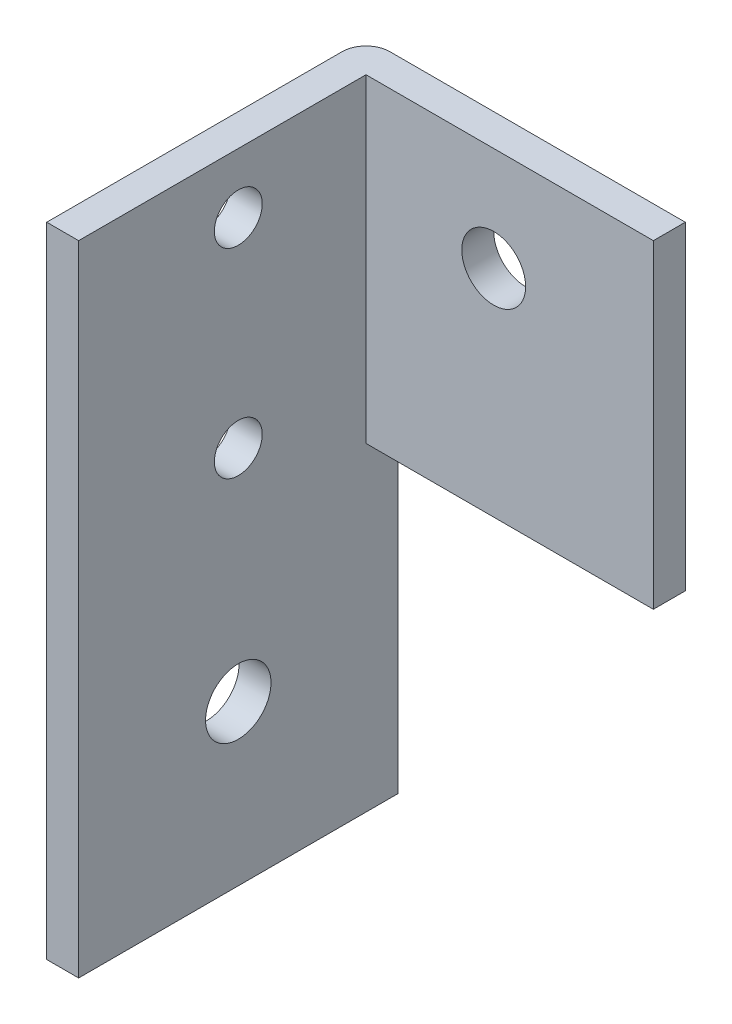
ISO-10303-21;
HEADER;
FILE_DESCRIPTION(('STEP AP214'),'2;1');
FILE_NAME('part.step','',(''),(''),'','','');
FILE_SCHEMA(('AUTOMOTIVE_DESIGN { 1 0 10303 214 1 1 1 1 }'));
ENDSEC;
DATA;
#1=APPLICATION_CONTEXT('core data for automotive mechanical design processes');
#2=APPLICATION_PROTOCOL_DEFINITION('international standard','automotive_design',2000,#1);
#3=PRODUCT_CONTEXT('',#1,'mechanical');
#4=PRODUCT('Part','Part','',(#3));
#5=PRODUCT_RELATED_PRODUCT_CATEGORY('part','',(#4));
#6=PRODUCT_DEFINITION_FORMATION('','',#4);
#7=PRODUCT_DEFINITION_CONTEXT('part definition',#1,'design');
#8=PRODUCT_DEFINITION('design','',#6,#7);
#9=PRODUCT_DEFINITION_SHAPE('','',#8);
#10=(LENGTH_UNIT() NAMED_UNIT(*) SI_UNIT(.MILLI.,.METRE.));
#11=(NAMED_UNIT(*) PLANE_ANGLE_UNIT() SI_UNIT($,.RADIAN.));
#12=(NAMED_UNIT(*) SI_UNIT($,.STERADIAN.) SOLID_ANGLE_UNIT());
#13=UNCERTAINTY_MEASURE_WITH_UNIT(LENGTH_MEASURE(1.E-05),#10,'distance_accuracy_value','');
#14=(GEOMETRIC_REPRESENTATION_CONTEXT(3) GLOBAL_UNCERTAINTY_ASSIGNED_CONTEXT((#13)) GLOBAL_UNIT_ASSIGNED_CONTEXT((#10,
#11,#12)) REPRESENTATION_CONTEXT('',''));
#15=CARTESIAN_POINT('',(0.,0.,0.));
#16=DIRECTION('',(0.,0.,1.));
#17=DIRECTION('',(1.,0.,0.));
#18=AXIS2_PLACEMENT_3D('',#15,#16,#17);
#19=CARTESIAN_POINT('',(-19.6589595375722,80.,-19.121387283237));
#20=DIRECTION('',(0.,0.,-1.));
#21=DIRECTION('',(-1.,0.,0.));
#22=AXIS2_PLACEMENT_3D('',#19,#20,#21);
#23=PLANE('',#22);
#24=CARTESIAN_POINT('',(-2.65895953757226,67.,-19.121387283237));
#25=DIRECTION('',(0.,0.,-1.));
#26=DIRECTION('',(-1.,0.,0.));
#27=AXIS2_PLACEMENT_3D('',#24,#25,#26);
#28=CIRCLE('',#27,3.99999999999999);
#29=CARTESIAN_POINT('',(-6.65895953757225,67.,-19.121387283237));
#30=VERTEX_POINT('',#29);
#31=EDGE_CURVE('E186',#30,#30,#28,.T.);
#32=ORIENTED_EDGE('',*,*,#31,.T.);
#33=EDGE_LOOP('',(#32));
#34=FACE_BOUND('',#33,.T.);
#35=DIRECTION('',(0.,-1.,0.));
#36=VECTOR('',#35,1.);
#37=CARTESIAN_POINT('',(-18.6589595375723,80.,-19.121387283237));
#38=LINE('',#37,#36);
#39=CARTESIAN_POINT('',(-18.6589595375723,80.,-19.121387283237));
#40=VERTEX_POINT('',#39);
#41=CARTESIAN_POINT('',(-18.6589595375723,40.,-19.121387283237));
#42=VERTEX_POINT('',#41);
#43=EDGE_CURVE('E117',#40,#42,#38,.T.);
#44=ORIENTED_EDGE('',*,*,#43,.T.);
#45=DIRECTION('',(1.,0.,0.));
#46=VECTOR('',#45,1.);
#47=CARTESIAN_POINT('',(-19.6589595375722,40.,-19.121387283237));
#48=LINE('',#47,#46);
#49=CARTESIAN_POINT('',(17.3410404624277,40.,-19.121387283237));
#50=VERTEX_POINT('',#49);
#51=EDGE_CURVE('E199',#42,#50,#48,.T.);
#52=ORIENTED_EDGE('',*,*,#51,.T.);
#53=DIRECTION('',(0.,-1.,0.));
#54=VECTOR('',#53,1.);
#55=CARTESIAN_POINT('',(17.3410404624277,80.,-19.121387283237));
#56=LINE('',#55,#54);
#57=CARTESIAN_POINT('',(17.3410404624277,80.,-19.121387283237));
#58=VERTEX_POINT('',#57);
#59=EDGE_CURVE('E11',#58,#50,#56,.T.);
#60=ORIENTED_EDGE('',*,*,#59,.F.);
#61=DIRECTION('',(1.,0.,0.));
#62=VECTOR('',#61,1.);
#63=CARTESIAN_POINT('',(-19.6589595375722,80.,-19.121387283237));
#64=LINE('',#63,#62);
#65=EDGE_CURVE('E86',#40,#58,#64,.T.);
#66=ORIENTED_EDGE('',*,*,#65,.F.);
#67=EDGE_LOOP('',(#44,#52,#60,#66));
#68=FACE_BOUND('',#67,.T.);
#69=ADVANCED_FACE('F37',(#34,#68),#23,.F.);
#70=CARTESIAN_POINT('',(17.3410404624277,80.,-23.121387283237));
#71=DIRECTION('',(1.,0.,0.));
#72=DIRECTION('',(0.,0.,-1.));
#73=AXIS2_PLACEMENT_3D('',#70,#71,#72);
#74=PLANE('',#73);
#75=DIRECTION('',(0.,0.,1.));
#76=VECTOR('',#75,1.);
#77=CARTESIAN_POINT('',(17.3410404624277,40.,-23.121387283237));
#78=LINE('',#77,#76);
#79=CARTESIAN_POINT('',(17.3410404624277,40.,-23.121387283237));
#80=VERTEX_POINT('',#79);
#81=EDGE_CURVE('E197',#80,#50,#78,.T.);
#82=ORIENTED_EDGE('',*,*,#81,.F.);
#83=DIRECTION('',(0.,-1.,0.));
#84=VECTOR('',#83,1.);
#85=CARTESIAN_POINT('',(17.3410404624277,80.,-23.121387283237));
#86=LINE('',#85,#84);
#87=CARTESIAN_POINT('',(17.3410404624277,80.,-23.121387283237));
#88=VERTEX_POINT('',#87);
#89=EDGE_CURVE('E46',#88,#80,#86,.T.);
#90=ORIENTED_EDGE('',*,*,#89,.F.);
#91=DIRECTION('',(0.,0.,1.));
#92=VECTOR('',#91,1.);
#93=CARTESIAN_POINT('',(17.3410404624277,80.,-23.121387283237));
#94=LINE('',#93,#92);
#95=EDGE_CURVE('E160',#88,#58,#94,.T.);
#96=ORIENTED_EDGE('',*,*,#95,.T.);
#97=ORIENTED_EDGE('',*,*,#59,.T.);
#98=EDGE_LOOP('',(#82,#90,#96,#97));
#99=FACE_BOUND('',#98,.T.);
#100=ADVANCED_FACE('F232',(#99),#74,.T.);
#101=CARTESIAN_POINT('',(-19.6589595375722,80.,-23.121387283237));
#102=DIRECTION('',(0.,0.,-1.));
#103=DIRECTION('',(-1.,0.,0.));
#104=AXIS2_PLACEMENT_3D('',#101,#102,#103);
#105=PLANE('',#104);
#106=CARTESIAN_POINT('',(-2.65895953757226,67.,-23.121387283237));
#107=DIRECTION('',(0.,0.,-1.));
#108=DIRECTION('',(-1.,0.,0.));
#109=AXIS2_PLACEMENT_3D('',#106,#107,#108);
#110=CIRCLE('',#109,3.99999999999999);
#111=CARTESIAN_POINT('',(-6.65895953757225,67.,-23.121387283237));
#112=VERTEX_POINT('',#111);
#113=EDGE_CURVE('E191',#112,#112,#110,.T.);
#114=ORIENTED_EDGE('',*,*,#113,.F.);
#115=EDGE_LOOP('',(#114));
#116=FACE_BOUND('',#115,.T.);
#117=DIRECTION('',(0.,1.,0.));
#118=VECTOR('',#117,1.);
#119=CARTESIAN_POINT('',(-18.6589595375723,40.,-23.121387283237));
#120=LINE('',#119,#118);
#121=CARTESIAN_POINT('',(-18.6589595375723,0.,-23.121387283237));
#122=VERTEX_POINT('',#121);
#123=CARTESIAN_POINT('',(-18.6589595375723,40.,-23.121387283237));
#124=VERTEX_POINT('',#123);
#125=EDGE_CURVE('E178',#122,#124,#120,.T.);
#126=ORIENTED_EDGE('',*,*,#125,.F.);
#127=DIRECTION('',(1.,0.,0.));
#128=VECTOR('',#127,1.);
#129=CARTESIAN_POINT('',(-19.6589595375722,0.,-23.121387283237));
#130=LINE('',#129,#128);
#131=CARTESIAN_POINT('',(-19.6589595375722,0.,-23.121387283237));
#132=VERTEX_POINT('',#131);
#133=EDGE_CURVE('E121',#132,#122,#130,.T.);
#134=ORIENTED_EDGE('',*,*,#133,.F.);
#135=DIRECTION('',(0.,-1.,0.));
#136=VECTOR('',#135,1.);
#137=CARTESIAN_POINT('',(-19.6589595375722,80.,-23.121387283237));
#138=LINE('',#137,#136);
#139=CARTESIAN_POINT('',(-19.6589595375722,80.,-23.121387283237));
#140=VERTEX_POINT('',#139);
#141=EDGE_CURVE('E137',#140,#132,#138,.T.);
#142=ORIENTED_EDGE('',*,*,#141,.F.);
#143=DIRECTION('',(1.,0.,0.));
#144=VECTOR('',#143,1.);
#145=CARTESIAN_POINT('',(-19.6589595375722,80.,-23.121387283237));
#146=LINE('',#145,#144);
#147=EDGE_CURVE('E163',#140,#88,#146,.T.);
#148=ORIENTED_EDGE('',*,*,#147,.T.);
#149=ORIENTED_EDGE('',*,*,#89,.T.);
#150=DIRECTION('',(1.,0.,0.));
#151=VECTOR('',#150,1.);
#152=CARTESIAN_POINT('',(38.7535883869143,40.,-23.121387283237));
#153=LINE('',#152,#151);
#154=EDGE_CURVE('E185',#124,#80,#153,.T.);
#155=ORIENTED_EDGE('',*,*,#154,.F.);
#156=EDGE_LOOP('',(#126,#134,#142,#148,#149,#155));
#157=FACE_BOUND('',#156,.T.);
#158=ADVANCED_FACE('F183',(#116,#157),#105,.T.);
#159=CARTESIAN_POINT('',(-19.6589595375723,80.,-20.121387283237));
#160=DIRECTION('',(0.,-1.,0.));
#161=DIRECTION('',(0.,0.,-1.));
#162=AXIS2_PLACEMENT_3D('',#159,#160,#161);
#163=CYLINDRICAL_SURFACE('',#162,3.);
#164=CARTESIAN_POINT('',(-19.6589595375723,0.,-20.121387283237));
#165=DIRECTION('',(0.,-1.,0.));
#166=DIRECTION('',(0.,0.,-1.));
#167=AXIS2_PLACEMENT_3D('',#164,#165,#166);
#168=CIRCLE('',#167,3.);
#169=CARTESIAN_POINT('',(-22.6589595375723,0.,-20.121387283237));
#170=VERTEX_POINT('',#169);
#171=EDGE_CURVE('E124',#170,#132,#168,.T.);
#172=ORIENTED_EDGE('',*,*,#171,.F.);
#173=DIRECTION('',(0.,-1.,0.));
#174=VECTOR('',#173,1.);
#175=CARTESIAN_POINT('',(-22.6589595375723,80.,-20.121387283237));
#176=LINE('',#175,#174);
#177=CARTESIAN_POINT('',(-22.6589595375723,80.,-20.121387283237));
#178=VERTEX_POINT('',#177);
#179=EDGE_CURVE('E106',#178,#170,#176,.T.);
#180=ORIENTED_EDGE('',*,*,#179,.F.);
#181=CARTESIAN_POINT('',(-19.6589595375723,80.,-20.121387283237));
#182=DIRECTION('',(0.,-1.,0.));
#183=DIRECTION('',(0.,0.,-1.));
#184=AXIS2_PLACEMENT_3D('',#181,#182,#183);
#185=CIRCLE('',#184,3.);
#186=EDGE_CURVE('E113',#178,#140,#185,.T.);
#187=ORIENTED_EDGE('',*,*,#186,.T.);
#188=ORIENTED_EDGE('',*,*,#141,.T.);
#189=EDGE_LOOP('',(#172,#180,#187,#188));
#190=FACE_BOUND('',#189,.T.);
#191=ADVANCED_FACE('F167',(#190),#163,.T.);
#192=CARTESIAN_POINT('',(-22.6589595375723,80.,16.878612716763));
#193=DIRECTION('',(-1.,0.,0.));
#194=DIRECTION('',(0.,0.,1.));
#195=AXIS2_PLACEMENT_3D('',#192,#193,#194);
#196=PLANE('',#195);
#197=CARTESIAN_POINT('',(-22.6589595375723,72.5,-3.12138728323695));
#198=DIRECTION('',(-1.,0.,0.));
#199=DIRECTION('',(0.,0.,1.));
#200=AXIS2_PLACEMENT_3D('',#197,#198,#199);
#201=CIRCLE('',#200,3.);
#202=CARTESIAN_POINT('',(-22.6589595375723,72.5,-0.12138728323695));
#203=VERTEX_POINT('',#202);
#204=EDGE_CURVE('E155',#203,#203,#201,.T.);
#205=ORIENTED_EDGE('',*,*,#204,.F.);
#206=EDGE_LOOP('',(#205));
#207=FACE_BOUND('',#206,.T.);
#208=CARTESIAN_POINT('',(-22.6589595375723,47.5,-3.12138728323695));
#209=DIRECTION('',(-1.,0.,0.));
#210=DIRECTION('',(0.,0.,1.));
#211=AXIS2_PLACEMENT_3D('',#208,#209,#210);
#212=CIRCLE('',#211,3.);
#213=CARTESIAN_POINT('',(-22.6589595375723,47.5,-0.121387283236947));
#214=VERTEX_POINT('',#213);
#215=EDGE_CURVE('E145',#214,#214,#212,.T.);
#216=ORIENTED_EDGE('',*,*,#215,.F.);
#217=EDGE_LOOP('',(#216));
#218=FACE_BOUND('',#217,.T.);
#219=CARTESIAN_POINT('',(-22.6589595375723,20.,-3.121387283237));
#220=DIRECTION('',(-1.,0.,0.));
#221=DIRECTION('',(0.,0.,1.));
#222=AXIS2_PLACEMENT_3D('',#219,#220,#221);
#223=CIRCLE('',#222,4.1);
#224=CARTESIAN_POINT('',(-22.6589595375723,20.,0.978612716763));
#225=VERTEX_POINT('',#224);
#226=EDGE_CURVE('E142',#225,#225,#223,.T.);
#227=ORIENTED_EDGE('',*,*,#226,.F.);
#228=EDGE_LOOP('',(#227));
#229=FACE_BOUND('',#228,.T.);
#230=DIRECTION('',(0.,0.,-1.));
#231=VECTOR('',#230,1.);
#232=CARTESIAN_POINT('',(-22.6589595375723,0.,16.878612716763));
#233=LINE('',#232,#231);
#234=CARTESIAN_POINT('',(-22.6589595375723,0.,16.878612716763));
#235=VERTEX_POINT('',#234);
#236=EDGE_CURVE('E104',#235,#170,#233,.T.);
#237=ORIENTED_EDGE('',*,*,#236,.F.);
#238=DIRECTION('',(0.,-1.,0.));
#239=VECTOR('',#238,1.);
#240=CARTESIAN_POINT('',(-22.6589595375723,80.,16.878612716763));
#241=LINE('',#240,#239);
#242=CARTESIAN_POINT('',(-22.6589595375723,80.,16.878612716763));
#243=VERTEX_POINT('',#242);
#244=EDGE_CURVE('E74',#243,#235,#241,.T.);
#245=ORIENTED_EDGE('',*,*,#244,.F.);
#246=DIRECTION('',(0.,0.,-1.));
#247=VECTOR('',#246,1.);
#248=CARTESIAN_POINT('',(-22.6589595375723,80.,16.878612716763));
#249=LINE('',#248,#247);
#250=EDGE_CURVE('E102',#243,#178,#249,.T.);
#251=ORIENTED_EDGE('',*,*,#250,.T.);
#252=ORIENTED_EDGE('',*,*,#179,.T.);
#253=EDGE_LOOP('',(#237,#245,#251,#252));
#254=FACE_BOUND('',#253,.T.);
#255=ADVANCED_FACE('F101',(#207,#218,#229,#254),#196,.T.);
#256=CARTESIAN_POINT('',(-18.6589595375723,80.,16.878612716763));
#257=DIRECTION('',(0.,0.,1.));
#258=DIRECTION('',(1.,0.,0.));
#259=AXIS2_PLACEMENT_3D('',#256,#257,#258);
#260=PLANE('',#259);
#261=DIRECTION('',(-1.,0.,0.));
#262=VECTOR('',#261,1.);
#263=CARTESIAN_POINT('',(-18.6589595375723,0.,16.878612716763));
#264=LINE('',#263,#262);
#265=CARTESIAN_POINT('',(-18.6589595375723,0.,16.878612716763));
#266=VERTEX_POINT('',#265);
#267=EDGE_CURVE('E129',#266,#235,#264,.T.);
#268=ORIENTED_EDGE('',*,*,#267,.F.);
#269=DIRECTION('',(0.,-1.,0.));
#270=VECTOR('',#269,1.);
#271=CARTESIAN_POINT('',(-18.6589595375723,80.,16.878612716763));
#272=LINE('',#271,#270);
#273=CARTESIAN_POINT('',(-18.6589595375723,80.,16.878612716763));
#274=VERTEX_POINT('',#273);
#275=EDGE_CURVE('E80',#274,#266,#272,.T.);
#276=ORIENTED_EDGE('',*,*,#275,.F.);
#277=DIRECTION('',(-1.,0.,0.));
#278=VECTOR('',#277,1.);
#279=CARTESIAN_POINT('',(-18.6589595375723,80.,16.878612716763));
#280=LINE('',#279,#278);
#281=EDGE_CURVE('E110',#274,#243,#280,.T.);
#282=ORIENTED_EDGE('',*,*,#281,.T.);
#283=ORIENTED_EDGE('',*,*,#244,.T.);
#284=EDGE_LOOP('',(#268,#276,#282,#283));
#285=FACE_BOUND('',#284,.T.);
#286=ADVANCED_FACE('F115',(#285),#260,.T.);
#287=CARTESIAN_POINT('',(-18.6589595375723,80.,16.878612716763));
#288=DIRECTION('',(-1.,0.,0.));
#289=DIRECTION('',(0.,0.,1.));
#290=AXIS2_PLACEMENT_3D('',#287,#288,#289);
#291=PLANE('',#290);
#292=DIRECTION('',(0.,0.,-1.));
#293=VECTOR('',#292,1.);
#294=CARTESIAN_POINT('',(-18.6589595375723,0.,16.878612716763));
#295=LINE('',#294,#293);
#296=EDGE_CURVE('E131',#266,#122,#295,.T.);
#297=ORIENTED_EDGE('',*,*,#296,.T.);
#298=ORIENTED_EDGE('',*,*,#125,.T.);
#299=DIRECTION('',(0.,0.,-1.));
#300=VECTOR('',#299,1.);
#301=CARTESIAN_POINT('',(-18.6589595375723,40.,-13.121387283237));
#302=LINE('',#301,#300);
#303=EDGE_CURVE('E188',#42,#124,#302,.T.);
#304=ORIENTED_EDGE('',*,*,#303,.F.);
#305=ORIENTED_EDGE('',*,*,#43,.F.);
#306=DIRECTION('',(0.,0.,-1.));
#307=VECTOR('',#306,1.);
#308=CARTESIAN_POINT('',(-18.6589595375723,80.,16.878612716763));
#309=LINE('',#308,#307);
#310=EDGE_CURVE('E55',#274,#40,#309,.T.);
#311=ORIENTED_EDGE('',*,*,#310,.F.);
#312=ORIENTED_EDGE('',*,*,#275,.T.);
#313=EDGE_LOOP('',(#297,#298,#304,#305,#311,#312));
#314=FACE_BOUND('',#313,.T.);
#315=CARTESIAN_POINT('',(-18.6589595375723,72.5,-3.12138728323695));
#316=DIRECTION('',(-1.,0.,0.));
#317=DIRECTION('',(0.,0.,1.));
#318=AXIS2_PLACEMENT_3D('',#315,#316,#317);
#319=CIRCLE('',#318,3.);
#320=CARTESIAN_POINT('',(-18.6589595375723,72.5,-0.12138728323695));
#321=VERTEX_POINT('',#320);
#322=EDGE_CURVE('E40',#321,#321,#319,.T.);
#323=ORIENTED_EDGE('',*,*,#322,.T.);
#324=EDGE_LOOP('',(#323));
#325=FACE_BOUND('',#324,.T.);
#326=CARTESIAN_POINT('',(-18.6589595375723,47.5,-3.12138728323695));
#327=DIRECTION('',(-1.,0.,0.));
#328=DIRECTION('',(0.,0.,1.));
#329=AXIS2_PLACEMENT_3D('',#326,#327,#328);
#330=CIRCLE('',#329,3.);
#331=CARTESIAN_POINT('',(-18.6589595375723,47.5,-0.121387283236947));
#332=VERTEX_POINT('',#331);
#333=EDGE_CURVE('E143',#332,#332,#330,.T.);
#334=ORIENTED_EDGE('',*,*,#333,.T.);
#335=EDGE_LOOP('',(#334));
#336=FACE_BOUND('',#335,.T.);
#337=CARTESIAN_POINT('',(-18.6589595375723,20.,-3.121387283237));
#338=DIRECTION('',(-1.,0.,0.));
#339=DIRECTION('',(0.,0.,1.));
#340=AXIS2_PLACEMENT_3D('',#337,#338,#339);
#341=CIRCLE('',#340,4.1);
#342=CARTESIAN_POINT('',(-18.6589595375723,20.,0.978612716763));
#343=VERTEX_POINT('',#342);
#344=EDGE_CURVE('E125',#343,#343,#341,.T.);
#345=ORIENTED_EDGE('',*,*,#344,.T.);
#346=EDGE_LOOP('',(#345));
#347=FACE_BOUND('',#346,.T.);
#348=ADVANCED_FACE('F174',(#314,#325,#336,#347),#291,.F.);
#349=CARTESIAN_POINT('',(-19.6589595375723,80.,-20.121387283237));
#350=DIRECTION('',(0.,-1.,0.));
#351=DIRECTION('',(-1.,0.,0.));
#352=AXIS2_PLACEMENT_3D('',#349,#350,#351);
#353=PLANE('',#352);
#354=ORIENTED_EDGE('',*,*,#65,.T.);
#355=ORIENTED_EDGE('',*,*,#95,.F.);
#356=ORIENTED_EDGE('',*,*,#147,.F.);
#357=ORIENTED_EDGE('',*,*,#186,.F.);
#358=ORIENTED_EDGE('',*,*,#250,.F.);
#359=ORIENTED_EDGE('',*,*,#281,.F.);
#360=ORIENTED_EDGE('',*,*,#310,.T.);
#361=EDGE_LOOP('',(#354,#355,#356,#357,#358,#359,#360));
#362=FACE_BOUND('',#361,.T.);
#363=ADVANCED_FACE('F109',(#362),#353,.F.);
#364=CARTESIAN_POINT('',(-19.6589595375723,0.,-20.121387283237));
#365=DIRECTION('',(0.,-1.,0.));
#366=DIRECTION('',(-1.,0.,0.));
#367=AXIS2_PLACEMENT_3D('',#364,#365,#366);
#368=PLANE('',#367);
#369=ORIENTED_EDGE('',*,*,#133,.T.);
#370=ORIENTED_EDGE('',*,*,#296,.F.);
#371=ORIENTED_EDGE('',*,*,#267,.T.);
#372=ORIENTED_EDGE('',*,*,#236,.T.);
#373=ORIENTED_EDGE('',*,*,#171,.T.);
#374=EDGE_LOOP('',(#369,#370,#371,#372,#373));
#375=FACE_BOUND('',#374,.T.);
#376=ADVANCED_FACE('F170',(#375),#368,.T.);
#377=CARTESIAN_POINT('',(-12.6589595375723,20.,-3.121387283237));
#378=DIRECTION('',(-1.,0.,0.));
#379=DIRECTION('',(0.,0.,1.));
#380=AXIS2_PLACEMENT_3D('',#377,#378,#379);
#381=CYLINDRICAL_SURFACE('',#380,4.1);
#382=ORIENTED_EDGE('',*,*,#226,.T.);
#383=EDGE_LOOP('',(#382));
#384=FACE_BOUND('',#383,.T.);
#385=ORIENTED_EDGE('',*,*,#344,.F.);
#386=EDGE_LOOP('',(#385));
#387=FACE_BOUND('',#386,.T.);
#388=ADVANCED_FACE('F215',(#384,#387),#381,.F.);
#389=CARTESIAN_POINT('',(-12.6589595375723,47.5,-3.12138728323695));
#390=DIRECTION('',(-1.,0.,0.));
#391=DIRECTION('',(0.,0.,1.));
#392=AXIS2_PLACEMENT_3D('',#389,#390,#391);
#393=CYLINDRICAL_SURFACE('',#392,3.);
#394=ORIENTED_EDGE('',*,*,#215,.T.);
#395=EDGE_LOOP('',(#394));
#396=FACE_BOUND('',#395,.T.);
#397=ORIENTED_EDGE('',*,*,#333,.F.);
#398=EDGE_LOOP('',(#397));
#399=FACE_BOUND('',#398,.T.);
#400=ADVANCED_FACE('F218',(#396,#399),#393,.F.);
#401=CARTESIAN_POINT('',(-12.6589595375723,72.5,-3.12138728323695));
#402=DIRECTION('',(-1.,0.,0.));
#403=DIRECTION('',(0.,0.,1.));
#404=AXIS2_PLACEMENT_3D('',#401,#402,#403);
#405=CYLINDRICAL_SURFACE('',#404,3.);
#406=ORIENTED_EDGE('',*,*,#204,.T.);
#407=EDGE_LOOP('',(#406));
#408=FACE_BOUND('',#407,.T.);
#409=ORIENTED_EDGE('',*,*,#322,.F.);
#410=EDGE_LOOP('',(#409));
#411=FACE_BOUND('',#410,.T.);
#412=ADVANCED_FACE('F206',(#408,#411),#405,.F.);
#413=CARTESIAN_POINT('',(38.7535883869143,40.,-13.121387283237));
#414=DIRECTION('',(0.,1.,0.));
#415=DIRECTION('',(0.,0.,1.));
#416=AXIS2_PLACEMENT_3D('',#413,#414,#415);
#417=PLANE('',#416);
#418=ORIENTED_EDGE('',*,*,#303,.T.);
#419=ORIENTED_EDGE('',*,*,#154,.T.);
#420=ORIENTED_EDGE('',*,*,#81,.T.);
#421=ORIENTED_EDGE('',*,*,#51,.F.);
#422=EDGE_LOOP('',(#418,#419,#420,#421));
#423=FACE_BOUND('',#422,.T.);
#424=ADVANCED_FACE('F241',(#423),#417,.F.);
#425=CARTESIAN_POINT('',(-2.65895953757226,67.,-23.121387283237));
#426=DIRECTION('',(0.,0.,-1.));
#427=DIRECTION('',(-1.,0.,0.));
#428=AXIS2_PLACEMENT_3D('',#425,#426,#427);
#429=CYLINDRICAL_SURFACE('',#428,3.99999999999999);
#430=ORIENTED_EDGE('',*,*,#113,.T.);
#431=EDGE_LOOP('',(#430));
#432=FACE_BOUND('',#431,.T.);
#433=ORIENTED_EDGE('',*,*,#31,.F.);
#434=EDGE_LOOP('',(#433));
#435=FACE_BOUND('',#434,.T.);
#436=ADVANCED_FACE('F246',(#432,#435),#429,.F.);
#437=CLOSED_SHELL('',(#69,#100,#158,#191,#255,#286,#348,#363,#376,#388,#400,#412,#424,#436));
#438=MANIFOLD_SOLID_BREP('B2',#437);
#439=ADVANCED_BREP_SHAPE_REPRESENTATION('',(#18,#438),#14);
#440=SHAPE_DEFINITION_REPRESENTATION(#9,#439);
ENDSEC;
END-ISO-10303-21;
